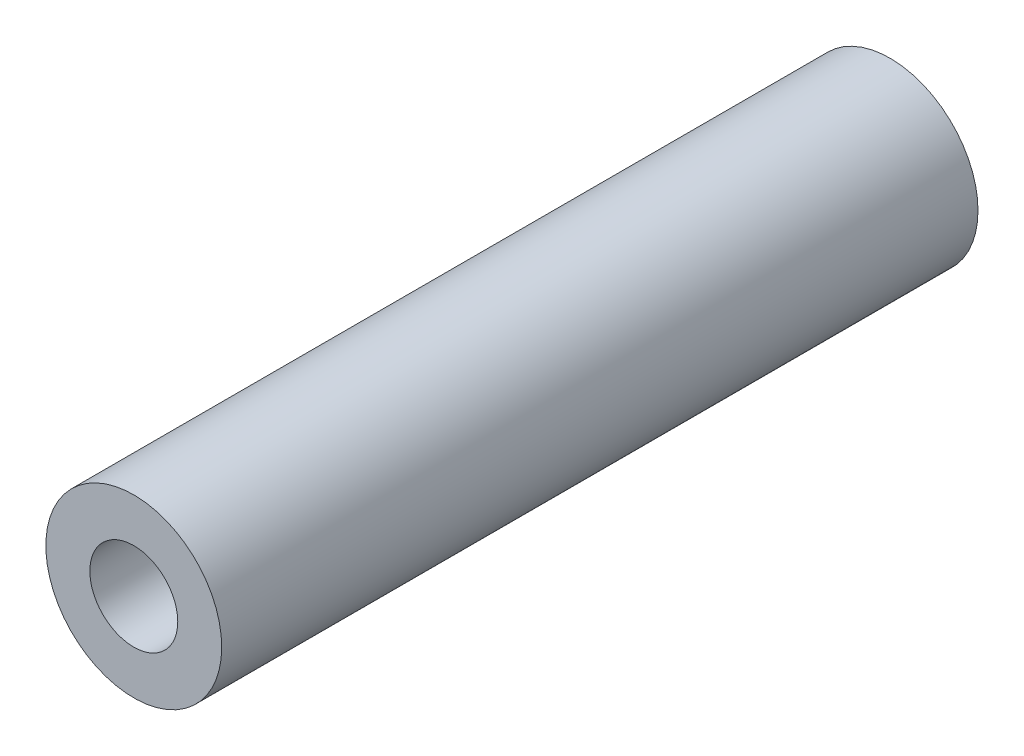
ISO-10303-21;
HEADER;
FILE_DESCRIPTION(('STEP AP214'),'2;1');
FILE_NAME('part.step','',(''),(''),'','','');
FILE_SCHEMA(('AUTOMOTIVE_DESIGN { 1 0 10303 214 1 1 1 1 }'));
ENDSEC;
DATA;
#1=APPLICATION_CONTEXT('core data for automotive mechanical design processes');
#2=APPLICATION_PROTOCOL_DEFINITION('international standard','automotive_design',2000,#1);
#3=PRODUCT_CONTEXT('',#1,'mechanical');
#4=PRODUCT('Part','Part','',(#3));
#5=PRODUCT_RELATED_PRODUCT_CATEGORY('part','',(#4));
#6=PRODUCT_DEFINITION_FORMATION('','',#4);
#7=PRODUCT_DEFINITION_CONTEXT('part definition',#1,'design');
#8=PRODUCT_DEFINITION('design','',#6,#7);
#9=PRODUCT_DEFINITION_SHAPE('','',#8);
#10=(LENGTH_UNIT() NAMED_UNIT(*) SI_UNIT(.MILLI.,.METRE.));
#11=(NAMED_UNIT(*) PLANE_ANGLE_UNIT() SI_UNIT($,.RADIAN.));
#12=(NAMED_UNIT(*) SI_UNIT($,.STERADIAN.) SOLID_ANGLE_UNIT());
#13=UNCERTAINTY_MEASURE_WITH_UNIT(LENGTH_MEASURE(1.E-05),#10,'distance_accuracy_value','');
#14=(GEOMETRIC_REPRESENTATION_CONTEXT(3) GLOBAL_UNCERTAINTY_ASSIGNED_CONTEXT((#13)) GLOBAL_UNIT_ASSIGNED_CONTEXT((#10,
#11,#12)) REPRESENTATION_CONTEXT('',''));
#15=CARTESIAN_POINT('',(0.,0.,0.));
#16=DIRECTION('',(0.,0.,1.));
#17=DIRECTION('',(1.,0.,0.));
#18=AXIS2_PLACEMENT_3D('',#15,#16,#17);
#19=CARTESIAN_POINT('',(0.,0.,43.));
#20=DIRECTION('',(0.,0.,-1.));
#21=DIRECTION('',(-1.,0.,0.));
#22=AXIS2_PLACEMENT_3D('',#19,#20,#21);
#23=CYLINDRICAL_SURFACE('',#22,5.);
#24=CARTESIAN_POINT('',(0.,0.,43.));
#25=DIRECTION('',(0.,0.,1.));
#26=DIRECTION('',(1.,0.,0.));
#27=AXIS2_PLACEMENT_3D('',#24,#25,#26);
#28=CIRCLE('',#27,5.);
#29=CARTESIAN_POINT('',(5.,0.,43.));
#30=VERTEX_POINT('',#29);
#31=EDGE_CURVE('E10',#30,#30,#28,.T.);
#32=ORIENTED_EDGE('',*,*,#31,.F.);
#33=EDGE_LOOP('',(#32));
#34=FACE_BOUND('',#33,.T.);
#35=CARTESIAN_POINT('',(0.,0.,0.));
#36=DIRECTION('',(0.,0.,1.));
#37=DIRECTION('',(1.,0.,0.));
#38=AXIS2_PLACEMENT_3D('',#35,#36,#37);
#39=CIRCLE('',#38,5.);
#40=CARTESIAN_POINT('',(5.,0.,0.));
#41=VERTEX_POINT('',#40);
#42=EDGE_CURVE('E42',#41,#41,#39,.T.);
#43=ORIENTED_EDGE('',*,*,#42,.T.);
#44=EDGE_LOOP('',(#43));
#45=FACE_BOUND('',#44,.T.);
#46=ADVANCED_FACE('F39',(#34,#45),#23,.T.);
#47=CARTESIAN_POINT('',(0.,0.,43.));
#48=DIRECTION('',(0.,0.,1.));
#49=DIRECTION('',(1.,0.,0.));
#50=AXIS2_PLACEMENT_3D('',#47,#48,#49);
#51=PLANE('',#50);
#52=CARTESIAN_POINT('',(0.,0.,43.));
#53=DIRECTION('',(0.,0.,1.));
#54=DIRECTION('',(1.,0.,0.));
#55=AXIS2_PLACEMENT_3D('',#52,#53,#54);
#56=CIRCLE('',#55,2.5);
#57=CARTESIAN_POINT('',(2.5,0.,43.));
#58=VERTEX_POINT('',#57);
#59=EDGE_CURVE('E53',#58,#58,#56,.T.);
#60=ORIENTED_EDGE('',*,*,#59,.F.);
#61=EDGE_LOOP('',(#60));
#62=FACE_BOUND('',#61,.T.);
#63=ORIENTED_EDGE('',*,*,#31,.T.);
#64=EDGE_LOOP('',(#63));
#65=FACE_BOUND('',#64,.T.);
#66=ADVANCED_FACE('F70',(#62,#65),#51,.T.);
#67=CARTESIAN_POINT('',(0.,0.,0.));
#68=DIRECTION('',(0.,0.,1.));
#69=DIRECTION('',(1.,0.,0.));
#70=AXIS2_PLACEMENT_3D('',#67,#68,#69);
#71=PLANE('',#70);
#72=ORIENTED_EDGE('',*,*,#42,.F.);
#73=EDGE_LOOP('',(#72));
#74=FACE_BOUND('',#73,.T.);
#75=ADVANCED_FACE('F66',(#74),#71,.F.);
#76=CARTESIAN_POINT('',(0.,0.,3.));
#77=DIRECTION('',(0.,0.,1.));
#78=DIRECTION('',(1.,0.,0.));
#79=AXIS2_PLACEMENT_3D('',#76,#77,#78);
#80=CYLINDRICAL_SURFACE('',#79,2.5);
#81=CARTESIAN_POINT('',(0.,0.,3.));
#82=DIRECTION('',(0.,0.,1.));
#83=DIRECTION('',(1.,0.,0.));
#84=AXIS2_PLACEMENT_3D('',#81,#82,#83);
#85=CIRCLE('',#84,2.5);
#86=CARTESIAN_POINT('',(2.5,0.,3.));
#87=VERTEX_POINT('',#86);
#88=EDGE_CURVE('E51',#87,#87,#85,.T.);
#89=ORIENTED_EDGE('',*,*,#88,.F.);
#90=EDGE_LOOP('',(#89));
#91=FACE_BOUND('',#90,.T.);
#92=ORIENTED_EDGE('',*,*,#59,.T.);
#93=EDGE_LOOP('',(#92));
#94=FACE_BOUND('',#93,.T.);
#95=ADVANCED_FACE('F63',(#91,#94),#80,.F.);
#96=CARTESIAN_POINT('',(0.,0.,3.));
#97=DIRECTION('',(0.,0.,1.));
#98=DIRECTION('',(1.,0.,0.));
#99=AXIS2_PLACEMENT_3D('',#96,#97,#98);
#100=PLANE('',#99);
#101=ORIENTED_EDGE('',*,*,#88,.T.);
#102=EDGE_LOOP('',(#101));
#103=FACE_BOUND('',#102,.T.);
#104=ADVANCED_FACE('F61',(#103),#100,.T.);
#105=CLOSED_SHELL('',(#46,#66,#75,#95,#104));
#106=MANIFOLD_SOLID_BREP('B2',#105);
#107=ADVANCED_BREP_SHAPE_REPRESENTATION('',(#18,#106),#14);
#108=SHAPE_DEFINITION_REPRESENTATION(#9,#107);
ENDSEC;
END-ISO-10303-21;
